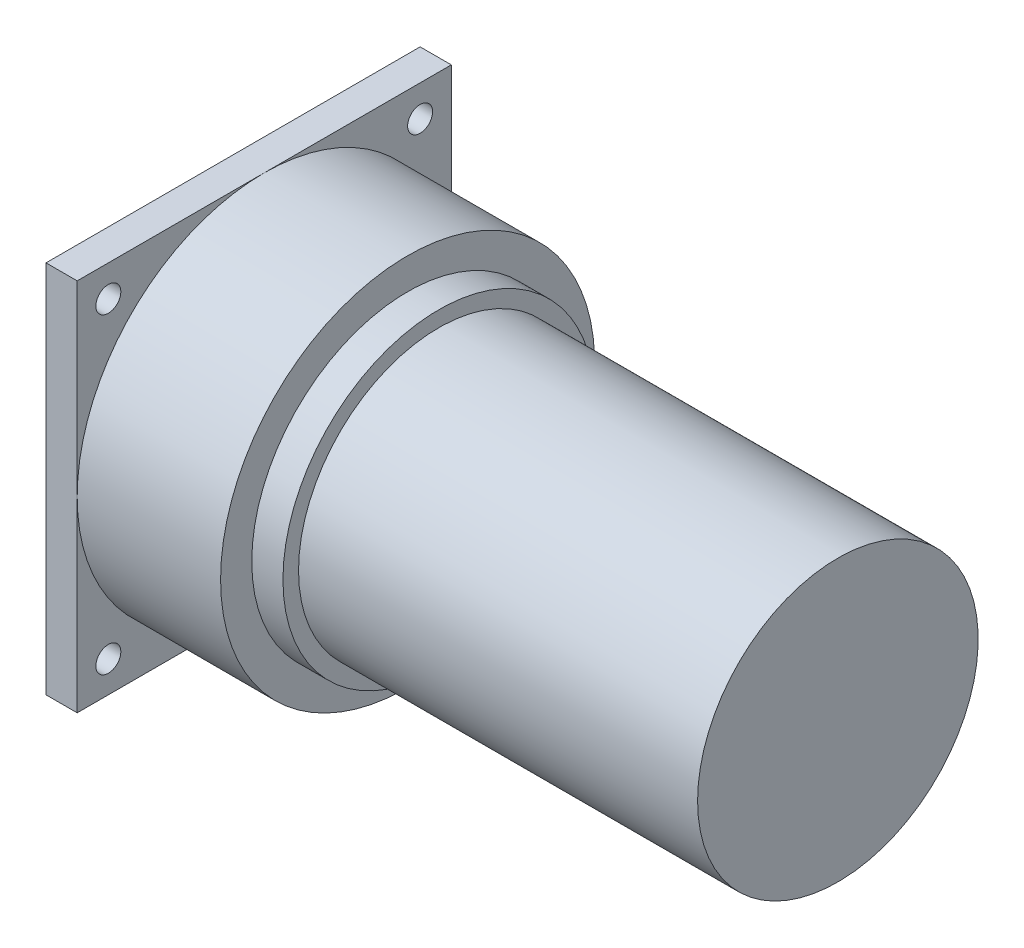
ISO-10303-21;
HEADER;
FILE_DESCRIPTION(('STEP AP214'),'2;1');
FILE_NAME('part.step','',(''),(''),'','','');
FILE_SCHEMA(('AUTOMOTIVE_DESIGN { 1 0 10303 214 1 1 1 1 }'));
ENDSEC;
DATA;
#1=APPLICATION_CONTEXT('core data for automotive mechanical design processes');
#2=APPLICATION_PROTOCOL_DEFINITION('international standard','automotive_design',2000,#1);
#3=PRODUCT_CONTEXT('',#1,'mechanical');
#4=PRODUCT('Part','Part','',(#3));
#5=PRODUCT_RELATED_PRODUCT_CATEGORY('part','',(#4));
#6=PRODUCT_DEFINITION_FORMATION('','',#4);
#7=PRODUCT_DEFINITION_CONTEXT('part definition',#1,'design');
#8=PRODUCT_DEFINITION('design','',#6,#7);
#9=PRODUCT_DEFINITION_SHAPE('','',#8);
#10=(LENGTH_UNIT() NAMED_UNIT(*) SI_UNIT(.MILLI.,.METRE.));
#11=(NAMED_UNIT(*) PLANE_ANGLE_UNIT() SI_UNIT($,.RADIAN.));
#12=(NAMED_UNIT(*) SI_UNIT($,.STERADIAN.) SOLID_ANGLE_UNIT());
#13=UNCERTAINTY_MEASURE_WITH_UNIT(LENGTH_MEASURE(1.E-05),#10,'distance_accuracy_value','');
#14=(GEOMETRIC_REPRESENTATION_CONTEXT(3) GLOBAL_UNCERTAINTY_ASSIGNED_CONTEXT((#13)) GLOBAL_UNIT_ASSIGNED_CONTEXT((#10,
#11,#12)) REPRESENTATION_CONTEXT('',''));
#15=CARTESIAN_POINT('',(0.,0.,0.));
#16=DIRECTION('',(0.,0.,1.));
#17=DIRECTION('',(1.,0.,0.));
#18=AXIS2_PLACEMENT_3D('',#15,#16,#17);
#19=CARTESIAN_POINT('',(0.,0.,0.));
#20=DIRECTION('',(-1.,0.,0.));
#21=DIRECTION('',(0.,0.,1.));
#22=AXIS2_PLACEMENT_3D('',#19,#20,#21);
#23=CYLINDRICAL_SURFACE('',#22,30.);
#24=CARTESIAN_POINT('',(22.,0.,0.));
#25=DIRECTION('',(-1.,0.,0.));
#26=DIRECTION('',(0.,0.,1.));
#27=AXIS2_PLACEMENT_3D('',#24,#25,#26);
#28=CIRCLE('',#27,30.);
#29=CARTESIAN_POINT('',(22.,0.,30.));
#30=VERTEX_POINT('',#29);
#31=CARTESIAN_POINT('',(22.,30.,0.));
#32=VERTEX_POINT('',#31);
#33=EDGE_CURVE('E140',#30,#32,#28,.T.);
#34=ORIENTED_EDGE('',*,*,#33,.F.);
#35=CARTESIAN_POINT('',(22.,-30.,0.));
#36=VERTEX_POINT('',#35);
#37=EDGE_CURVE('E139',#36,#30,#28,.T.);
#38=ORIENTED_EDGE('',*,*,#37,.F.);
#39=CARTESIAN_POINT('',(22.,0.,-30.));
#40=VERTEX_POINT('',#39);
#41=EDGE_CURVE('E55',#40,#36,#28,.T.);
#42=ORIENTED_EDGE('',*,*,#41,.F.);
#43=EDGE_CURVE('E59',#32,#40,#28,.T.);
#44=ORIENTED_EDGE('',*,*,#43,.F.);
#45=EDGE_LOOP('',(#34,#38,#42,#44));
#46=FACE_BOUND('',#45,.T.);
#47=CARTESIAN_POINT('',(45.,0.,0.));
#48=DIRECTION('',(-1.,0.,0.));
#49=DIRECTION('',(0.,0.,1.));
#50=AXIS2_PLACEMENT_3D('',#47,#48,#49);
#51=CIRCLE('',#50,30.);
#52=CARTESIAN_POINT('',(45.,0.,30.));
#53=VERTEX_POINT('',#52);
#54=EDGE_CURVE('E136',#53,#53,#51,.T.);
#55=ORIENTED_EDGE('',*,*,#54,.T.);
#56=EDGE_LOOP('',(#55));
#57=FACE_BOUND('',#56,.T.);
#58=ADVANCED_FACE('F40',(#46,#57),#23,.T.);
#59=CARTESIAN_POINT('',(45.,0.,-30.));
#60=DIRECTION('',(-1.,0.,0.));
#61=DIRECTION('',(0.,0.,1.));
#62=AXIS2_PLACEMENT_3D('',#59,#60,#61);
#63=PLANE('',#62);
#64=ORIENTED_EDGE('',*,*,#54,.F.);
#65=EDGE_LOOP('',(#64));
#66=FACE_BOUND('',#65,.T.);
#67=CARTESIAN_POINT('',(45.,0.,0.));
#68=DIRECTION('',(-1.,0.,0.));
#69=DIRECTION('',(0.,0.,1.));
#70=AXIS2_PLACEMENT_3D('',#67,#68,#69);
#71=CIRCLE('',#70,25.);
#72=CARTESIAN_POINT('',(45.,0.,25.));
#73=VERTEX_POINT('',#72);
#74=EDGE_CURVE('E133',#73,#73,#71,.T.);
#75=ORIENTED_EDGE('',*,*,#74,.T.);
#76=EDGE_LOOP('',(#75));
#77=FACE_BOUND('',#76,.T.);
#78=ADVANCED_FACE('F165',(#66,#77),#63,.F.);
#79=CARTESIAN_POINT('',(0.,0.,0.));
#80=DIRECTION('',(-1.,0.,0.));
#81=DIRECTION('',(0.,0.,1.));
#82=AXIS2_PLACEMENT_3D('',#79,#80,#81);
#83=CYLINDRICAL_SURFACE('',#82,25.);
#84=ORIENTED_EDGE('',*,*,#74,.F.);
#85=EDGE_LOOP('',(#84));
#86=FACE_BOUND('',#85,.T.);
#87=CARTESIAN_POINT('',(50.,0.,0.));
#88=DIRECTION('',(-1.,0.,0.));
#89=DIRECTION('',(0.,0.,1.));
#90=AXIS2_PLACEMENT_3D('',#87,#88,#89);
#91=CIRCLE('',#90,25.);
#92=CARTESIAN_POINT('',(50.,0.,25.));
#93=VERTEX_POINT('',#92);
#94=EDGE_CURVE('E130',#93,#93,#91,.T.);
#95=ORIENTED_EDGE('',*,*,#94,.T.);
#96=EDGE_LOOP('',(#95));
#97=FACE_BOUND('',#96,.T.);
#98=ADVANCED_FACE('F170',(#86,#97),#83,.T.);
#99=CARTESIAN_POINT('',(50.,0.,-25.));
#100=DIRECTION('',(-1.,0.,0.));
#101=DIRECTION('',(0.,0.,1.));
#102=AXIS2_PLACEMENT_3D('',#99,#100,#101);
#103=PLANE('',#102);
#104=ORIENTED_EDGE('',*,*,#94,.F.);
#105=EDGE_LOOP('',(#104));
#106=FACE_BOUND('',#105,.T.);
#107=CARTESIAN_POINT('',(50.,0.,0.));
#108=DIRECTION('',(-1.,0.,0.));
#109=DIRECTION('',(0.,0.,1.));
#110=AXIS2_PLACEMENT_3D('',#107,#108,#109);
#111=CIRCLE('',#110,22.5);
#112=CARTESIAN_POINT('',(50.,0.,22.5));
#113=VERTEX_POINT('',#112);
#114=EDGE_CURVE('E122',#113,#113,#111,.T.);
#115=ORIENTED_EDGE('',*,*,#114,.T.);
#116=EDGE_LOOP('',(#115));
#117=FACE_BOUND('',#116,.T.);
#118=ADVANCED_FACE('F177',(#106,#117),#103,.F.);
#119=CARTESIAN_POINT('',(0.,0.,0.));
#120=DIRECTION('',(-1.,0.,0.));
#121=DIRECTION('',(0.,0.,1.));
#122=AXIS2_PLACEMENT_3D('',#119,#120,#121);
#123=CYLINDRICAL_SURFACE('',#122,22.5);
#124=ORIENTED_EDGE('',*,*,#114,.F.);
#125=EDGE_LOOP('',(#124));
#126=FACE_BOUND('',#125,.T.);
#127=CARTESIAN_POINT('',(114.,0.,0.));
#128=DIRECTION('',(-1.,0.,0.));
#129=DIRECTION('',(0.,0.,1.));
#130=AXIS2_PLACEMENT_3D('',#127,#128,#129);
#131=CIRCLE('',#130,22.5);
#132=CARTESIAN_POINT('',(114.,0.,22.5));
#133=VERTEX_POINT('',#132);
#134=EDGE_CURVE('E119',#133,#133,#131,.T.);
#135=ORIENTED_EDGE('',*,*,#134,.T.);
#136=EDGE_LOOP('',(#135));
#137=FACE_BOUND('',#136,.T.);
#138=ADVANCED_FACE('F181',(#126,#137),#123,.T.);
#139=CARTESIAN_POINT('',(114.,0.,-22.5));
#140=DIRECTION('',(-1.,0.,0.));
#141=DIRECTION('',(0.,0.,1.));
#142=AXIS2_PLACEMENT_3D('',#139,#140,#141);
#143=PLANE('',#142);
#144=ORIENTED_EDGE('',*,*,#134,.F.);
#145=EDGE_LOOP('',(#144));
#146=FACE_BOUND('',#145,.T.);
#147=ADVANCED_FACE('F185',(#146),#143,.F.);
#148=CARTESIAN_POINT('',(22.,0.,0.));
#149=DIRECTION('',(1.,0.,0.));
#150=DIRECTION('',(0.,0.,-1.));
#151=AXIS2_PLACEMENT_3D('',#148,#149,#150);
#152=PLANE('',#151);
#153=ORIENTED_EDGE('',*,*,#43,.T.);
#154=DIRECTION('',(0.,-1.,0.));
#155=VECTOR('',#154,1.);
#156=CARTESIAN_POINT('',(22.,-30.,-30.));
#157=LINE('',#156,#155);
#158=CARTESIAN_POINT('',(22.,30.,-30.));
#159=VERTEX_POINT('',#158);
#160=EDGE_CURVE('E225',#159,#40,#157,.T.);
#161=ORIENTED_EDGE('',*,*,#160,.F.);
#162=DIRECTION('',(0.,0.,-1.));
#163=VECTOR('',#162,1.);
#164=CARTESIAN_POINT('',(22.,30.,-30.));
#165=LINE('',#164,#163);
#166=EDGE_CURVE('E211',#32,#159,#165,.T.);
#167=ORIENTED_EDGE('',*,*,#166,.F.);
#168=EDGE_LOOP('',(#153,#161,#167));
#169=FACE_BOUND('',#168,.T.);
#170=CARTESIAN_POINT('',(22.,25.,-25.));
#171=DIRECTION('',(-1.,0.,0.));
#172=DIRECTION('',(0.,0.,1.));
#173=AXIS2_PLACEMENT_3D('',#170,#171,#172);
#174=CIRCLE('',#173,2.00000000000001);
#175=CARTESIAN_POINT('',(22.,25.,-23.));
#176=VERTEX_POINT('',#175);
#177=EDGE_CURVE('E240',#176,#176,#174,.T.);
#178=ORIENTED_EDGE('',*,*,#177,.T.);
#179=EDGE_LOOP('',(#178));
#180=FACE_BOUND('',#179,.T.);
#181=ADVANCED_FACE('F160',(#169,#180),#152,.T.);
#182=ORIENTED_EDGE('',*,*,#33,.T.);
#183=CARTESIAN_POINT('',(22.,30.,30.));
#184=VERTEX_POINT('',#183);
#185=EDGE_CURVE('E112',#184,#32,#165,.T.);
#186=ORIENTED_EDGE('',*,*,#185,.F.);
#187=DIRECTION('',(0.,1.,0.));
#188=VECTOR('',#187,1.);
#189=CARTESIAN_POINT('',(22.,-30.,30.));
#190=LINE('',#189,#188);
#191=EDGE_CURVE('E228',#30,#184,#190,.T.);
#192=ORIENTED_EDGE('',*,*,#191,.F.);
#193=EDGE_LOOP('',(#182,#186,#192));
#194=FACE_BOUND('',#193,.T.);
#195=CARTESIAN_POINT('',(22.,25.,25.));
#196=DIRECTION('',(-1.,0.,0.));
#197=DIRECTION('',(0.,0.,1.));
#198=AXIS2_PLACEMENT_3D('',#195,#196,#197);
#199=CIRCLE('',#198,2.00000000000001);
#200=CARTESIAN_POINT('',(22.,25.,27.));
#201=VERTEX_POINT('',#200);
#202=EDGE_CURVE('E247',#201,#201,#199,.T.);
#203=ORIENTED_EDGE('',*,*,#202,.T.);
#204=EDGE_LOOP('',(#203));
#205=FACE_BOUND('',#204,.T.);
#206=ADVANCED_FACE('F161',(#194,#205),#152,.T.);
#207=ORIENTED_EDGE('',*,*,#37,.T.);
#208=CARTESIAN_POINT('',(22.,-30.,30.));
#209=VERTEX_POINT('',#208);
#210=EDGE_CURVE('E216',#209,#30,#190,.T.);
#211=ORIENTED_EDGE('',*,*,#210,.F.);
#212=DIRECTION('',(0.,0.,1.));
#213=VECTOR('',#212,1.);
#214=CARTESIAN_POINT('',(22.,-30.,-30.));
#215=LINE('',#214,#213);
#216=EDGE_CURVE('E226',#36,#209,#215,.T.);
#217=ORIENTED_EDGE('',*,*,#216,.F.);
#218=EDGE_LOOP('',(#207,#211,#217));
#219=FACE_BOUND('',#218,.T.);
#220=CARTESIAN_POINT('',(22.,-25.,25.));
#221=DIRECTION('',(-1.,0.,0.));
#222=DIRECTION('',(0.,0.,1.));
#223=AXIS2_PLACEMENT_3D('',#220,#221,#222);
#224=CIRCLE('',#223,2.00000000000001);
#225=CARTESIAN_POINT('',(22.,-25.,27.));
#226=VERTEX_POINT('',#225);
#227=EDGE_CURVE('E253',#226,#226,#224,.T.);
#228=ORIENTED_EDGE('',*,*,#227,.T.);
#229=EDGE_LOOP('',(#228));
#230=FACE_BOUND('',#229,.T.);
#231=ADVANCED_FACE('F152',(#219,#230),#152,.T.);
#232=CARTESIAN_POINT('',(17.,0.,0.));
#233=DIRECTION('',(1.,0.,0.));
#234=DIRECTION('',(0.,0.,-1.));
#235=AXIS2_PLACEMENT_3D('',#232,#233,#234);
#236=PLANE('',#235);
#237=CARTESIAN_POINT('',(17.,0.,0.));
#238=DIRECTION('',(1.,0.,0.));
#239=DIRECTION('',(0.,0.,-1.));
#240=AXIS2_PLACEMENT_3D('',#237,#238,#239);
#241=CIRCLE('',#240,4.);
#242=CARTESIAN_POINT('',(17.,0.,-4.));
#243=VERTEX_POINT('',#242);
#244=EDGE_CURVE('E11',#243,#243,#241,.T.);
#245=ORIENTED_EDGE('',*,*,#244,.T.);
#246=EDGE_LOOP('',(#245));
#247=FACE_BOUND('',#246,.T.);
#248=DIRECTION('',(0.,-1.,0.));
#249=VECTOR('',#248,1.);
#250=CARTESIAN_POINT('',(17.,-30.,-30.));
#251=LINE('',#250,#249);
#252=CARTESIAN_POINT('',(17.,30.,-30.));
#253=VERTEX_POINT('',#252);
#254=CARTESIAN_POINT('',(17.,-30.,-30.));
#255=VERTEX_POINT('',#254);
#256=EDGE_CURVE('E102',#253,#255,#251,.T.);
#257=ORIENTED_EDGE('',*,*,#256,.T.);
#258=DIRECTION('',(0.,0.,1.));
#259=VECTOR('',#258,1.);
#260=CARTESIAN_POINT('',(17.,-30.,-30.));
#261=LINE('',#260,#259);
#262=CARTESIAN_POINT('',(17.,-30.,30.));
#263=VERTEX_POINT('',#262);
#264=EDGE_CURVE('E91',#255,#263,#261,.T.);
#265=ORIENTED_EDGE('',*,*,#264,.T.);
#266=DIRECTION('',(0.,1.,0.));
#267=VECTOR('',#266,1.);
#268=CARTESIAN_POINT('',(17.,-30.,30.));
#269=LINE('',#268,#267);
#270=CARTESIAN_POINT('',(17.,30.,30.));
#271=VERTEX_POINT('',#270);
#272=EDGE_CURVE('E101',#263,#271,#269,.T.);
#273=ORIENTED_EDGE('',*,*,#272,.T.);
#274=DIRECTION('',(0.,0.,-1.));
#275=VECTOR('',#274,1.);
#276=CARTESIAN_POINT('',(17.,30.,-30.));
#277=LINE('',#276,#275);
#278=EDGE_CURVE('E108',#271,#253,#277,.T.);
#279=ORIENTED_EDGE('',*,*,#278,.T.);
#280=EDGE_LOOP('',(#257,#265,#273,#279));
#281=FACE_BOUND('',#280,.T.);
#282=CARTESIAN_POINT('',(17.,25.,-25.));
#283=DIRECTION('',(-1.,0.,0.));
#284=DIRECTION('',(0.,0.,1.));
#285=AXIS2_PLACEMENT_3D('',#282,#283,#284);
#286=CIRCLE('',#285,2.00000000000001);
#287=CARTESIAN_POINT('',(17.,25.,-23.));
#288=VERTEX_POINT('',#287);
#289=EDGE_CURVE('E238',#288,#288,#286,.T.);
#290=ORIENTED_EDGE('',*,*,#289,.F.);
#291=EDGE_LOOP('',(#290));
#292=FACE_BOUND('',#291,.T.);
#293=CARTESIAN_POINT('',(17.,25.,25.));
#294=DIRECTION('',(-1.,0.,0.));
#295=DIRECTION('',(0.,0.,1.));
#296=AXIS2_PLACEMENT_3D('',#293,#294,#295);
#297=CIRCLE('',#296,2.00000000000001);
#298=CARTESIAN_POINT('',(17.,25.,27.));
#299=VERTEX_POINT('',#298);
#300=EDGE_CURVE('E244',#299,#299,#297,.T.);
#301=ORIENTED_EDGE('',*,*,#300,.F.);
#302=EDGE_LOOP('',(#301));
#303=FACE_BOUND('',#302,.T.);
#304=CARTESIAN_POINT('',(17.,-25.,25.));
#305=DIRECTION('',(-1.,0.,0.));
#306=DIRECTION('',(0.,0.,1.));
#307=AXIS2_PLACEMENT_3D('',#304,#305,#306);
#308=CIRCLE('',#307,2.00000000000001);
#309=CARTESIAN_POINT('',(17.,-25.,27.));
#310=VERTEX_POINT('',#309);
#311=EDGE_CURVE('E250',#310,#310,#308,.T.);
#312=ORIENTED_EDGE('',*,*,#311,.F.);
#313=EDGE_LOOP('',(#312));
#314=FACE_BOUND('',#313,.T.);
#315=CARTESIAN_POINT('',(17.,-25.,-25.));
#316=DIRECTION('',(-1.,0.,0.));
#317=DIRECTION('',(0.,0.,1.));
#318=AXIS2_PLACEMENT_3D('',#315,#316,#317);
#319=CIRCLE('',#318,2.00000000000001);
#320=CARTESIAN_POINT('',(17.,-25.,-23.));
#321=VERTEX_POINT('',#320);
#322=EDGE_CURVE('E256',#321,#321,#319,.T.);
#323=ORIENTED_EDGE('',*,*,#322,.F.);
#324=EDGE_LOOP('',(#323));
#325=FACE_BOUND('',#324,.T.);
#326=ADVANCED_FACE('F105',(#247,#281,#292,#303,#314,#325),#236,.F.);
#327=ORIENTED_EDGE('',*,*,#41,.T.);
#328=CARTESIAN_POINT('',(22.,-30.,-30.));
#329=VERTEX_POINT('',#328);
#330=EDGE_CURVE('E227',#329,#36,#215,.T.);
#331=ORIENTED_EDGE('',*,*,#330,.F.);
#332=EDGE_CURVE('E117',#40,#329,#157,.T.);
#333=ORIENTED_EDGE('',*,*,#332,.F.);
#334=EDGE_LOOP('',(#327,#331,#333));
#335=FACE_BOUND('',#334,.T.);
#336=CARTESIAN_POINT('',(22.,-25.,-25.));
#337=DIRECTION('',(-1.,0.,0.));
#338=DIRECTION('',(0.,0.,1.));
#339=AXIS2_PLACEMENT_3D('',#336,#337,#338);
#340=CIRCLE('',#339,2.00000000000001);
#341=CARTESIAN_POINT('',(22.,-25.,-23.));
#342=VERTEX_POINT('',#341);
#343=EDGE_CURVE('E259',#342,#342,#340,.T.);
#344=ORIENTED_EDGE('',*,*,#343,.T.);
#345=EDGE_LOOP('',(#344));
#346=FACE_BOUND('',#345,.T.);
#347=ADVANCED_FACE('F151',(#335,#346),#152,.T.);
#348=CARTESIAN_POINT('',(17.,-30.,-30.));
#349=DIRECTION('',(0.,0.,1.));
#350=DIRECTION('',(0.,-1.,0.));
#351=AXIS2_PLACEMENT_3D('',#348,#349,#350);
#352=PLANE('',#351);
#353=ORIENTED_EDGE('',*,*,#160,.T.);
#354=ORIENTED_EDGE('',*,*,#332,.T.);
#355=DIRECTION('',(1.,0.,0.));
#356=VECTOR('',#355,1.);
#357=CARTESIAN_POINT('',(17.,-30.,-30.));
#358=LINE('',#357,#356);
#359=EDGE_CURVE('E96',#255,#329,#358,.T.);
#360=ORIENTED_EDGE('',*,*,#359,.F.);
#361=ORIENTED_EDGE('',*,*,#256,.F.);
#362=DIRECTION('',(1.,0.,0.));
#363=VECTOR('',#362,1.);
#364=CARTESIAN_POINT('',(17.,30.,-30.));
#365=LINE('',#364,#363);
#366=EDGE_CURVE('E220',#253,#159,#365,.T.);
#367=ORIENTED_EDGE('',*,*,#366,.T.);
#368=EDGE_LOOP('',(#353,#354,#360,#361,#367));
#369=FACE_BOUND('',#368,.T.);
#370=ADVANCED_FACE('F115',(#369),#352,.F.);
#371=CARTESIAN_POINT('',(17.,-30.,-30.));
#372=DIRECTION('',(0.,1.,0.));
#373=DIRECTION('',(0.,0.,1.));
#374=AXIS2_PLACEMENT_3D('',#371,#372,#373);
#375=PLANE('',#374);
#376=ORIENTED_EDGE('',*,*,#330,.T.);
#377=ORIENTED_EDGE('',*,*,#216,.T.);
#378=DIRECTION('',(1.,0.,0.));
#379=VECTOR('',#378,1.);
#380=CARTESIAN_POINT('',(17.,-30.,30.));
#381=LINE('',#380,#379);
#382=EDGE_CURVE('E98',#263,#209,#381,.T.);
#383=ORIENTED_EDGE('',*,*,#382,.F.);
#384=ORIENTED_EDGE('',*,*,#264,.F.);
#385=ORIENTED_EDGE('',*,*,#359,.T.);
#386=EDGE_LOOP('',(#376,#377,#383,#384,#385));
#387=FACE_BOUND('',#386,.T.);
#388=ADVANCED_FACE('F94',(#387),#375,.F.);
#389=CARTESIAN_POINT('',(17.,-30.,30.));
#390=DIRECTION('',(0.,0.,-1.));
#391=DIRECTION('',(-1.,0.,0.));
#392=AXIS2_PLACEMENT_3D('',#389,#390,#391);
#393=PLANE('',#392);
#394=ORIENTED_EDGE('',*,*,#210,.T.);
#395=ORIENTED_EDGE('',*,*,#191,.T.);
#396=DIRECTION('',(1.,0.,0.));
#397=VECTOR('',#396,1.);
#398=CARTESIAN_POINT('',(17.,30.,30.));
#399=LINE('',#398,#397);
#400=EDGE_CURVE('E124',#271,#184,#399,.T.);
#401=ORIENTED_EDGE('',*,*,#400,.F.);
#402=ORIENTED_EDGE('',*,*,#272,.F.);
#403=ORIENTED_EDGE('',*,*,#382,.T.);
#404=EDGE_LOOP('',(#394,#395,#401,#402,#403));
#405=FACE_BOUND('',#404,.T.);
#406=ADVANCED_FACE('F194',(#405),#393,.F.);
#407=CARTESIAN_POINT('',(17.,30.,-30.));
#408=DIRECTION('',(0.,-1.,0.));
#409=DIRECTION('',(0.,0.,-1.));
#410=AXIS2_PLACEMENT_3D('',#407,#408,#409);
#411=PLANE('',#410);
#412=ORIENTED_EDGE('',*,*,#185,.T.);
#413=ORIENTED_EDGE('',*,*,#166,.T.);
#414=ORIENTED_EDGE('',*,*,#366,.F.);
#415=ORIENTED_EDGE('',*,*,#278,.F.);
#416=ORIENTED_EDGE('',*,*,#400,.T.);
#417=EDGE_LOOP('',(#412,#413,#414,#415,#416));
#418=FACE_BOUND('',#417,.T.);
#419=ADVANCED_FACE('F197',(#418),#411,.F.);
#420=CARTESIAN_POINT('',(17.,25.,-25.));
#421=DIRECTION('',(1.,0.,0.));
#422=DIRECTION('',(0.,0.,-1.));
#423=AXIS2_PLACEMENT_3D('',#420,#421,#422);
#424=CYLINDRICAL_SURFACE('',#423,2.00000000000001);
#425=ORIENTED_EDGE('',*,*,#289,.T.);
#426=EDGE_LOOP('',(#425));
#427=FACE_BOUND('',#426,.T.);
#428=ORIENTED_EDGE('',*,*,#177,.F.);
#429=EDGE_LOOP('',(#428));
#430=FACE_BOUND('',#429,.T.);
#431=ADVANCED_FACE('F200',(#427,#430),#424,.F.);
#432=CARTESIAN_POINT('',(17.,25.,25.));
#433=DIRECTION('',(1.,0.,0.));
#434=DIRECTION('',(0.,0.,-1.));
#435=AXIS2_PLACEMENT_3D('',#432,#433,#434);
#436=CYLINDRICAL_SURFACE('',#435,2.00000000000001);
#437=ORIENTED_EDGE('',*,*,#300,.T.);
#438=EDGE_LOOP('',(#437));
#439=FACE_BOUND('',#438,.T.);
#440=ORIENTED_EDGE('',*,*,#202,.F.);
#441=EDGE_LOOP('',(#440));
#442=FACE_BOUND('',#441,.T.);
#443=ADVANCED_FACE('F205',(#439,#442),#436,.F.);
#444=CARTESIAN_POINT('',(17.,-25.,25.));
#445=DIRECTION('',(1.,0.,0.));
#446=DIRECTION('',(0.,0.,-1.));
#447=AXIS2_PLACEMENT_3D('',#444,#445,#446);
#448=CYLINDRICAL_SURFACE('',#447,2.00000000000001);
#449=ORIENTED_EDGE('',*,*,#311,.T.);
#450=EDGE_LOOP('',(#449));
#451=FACE_BOUND('',#450,.T.);
#452=ORIENTED_EDGE('',*,*,#227,.F.);
#453=EDGE_LOOP('',(#452));
#454=FACE_BOUND('',#453,.T.);
#455=ADVANCED_FACE('F269',(#451,#454),#448,.F.);
#456=CARTESIAN_POINT('',(17.,-25.,-25.));
#457=DIRECTION('',(1.,0.,0.));
#458=DIRECTION('',(0.,0.,-1.));
#459=AXIS2_PLACEMENT_3D('',#456,#457,#458);
#460=CYLINDRICAL_SURFACE('',#459,2.00000000000001);
#461=ORIENTED_EDGE('',*,*,#322,.T.);
#462=EDGE_LOOP('',(#461));
#463=FACE_BOUND('',#462,.T.);
#464=ORIENTED_EDGE('',*,*,#343,.F.);
#465=EDGE_LOOP('',(#464));
#466=FACE_BOUND('',#465,.T.);
#467=ADVANCED_FACE('F265',(#463,#466),#460,.F.);
#468=CARTESIAN_POINT('',(0.,0.,0.));
#469=DIRECTION('',(1.,0.,0.));
#470=DIRECTION('',(0.,0.,-1.));
#471=AXIS2_PLACEMENT_3D('',#468,#469,#470);
#472=PLANE('',#471);
#473=CARTESIAN_POINT('',(0.,0.,0.));
#474=DIRECTION('',(-1.,0.,0.));
#475=DIRECTION('',(0.,0.,1.));
#476=AXIS2_PLACEMENT_3D('',#473,#474,#475);
#477=CIRCLE('',#476,4.);
#478=CARTESIAN_POINT('',(0.,0.,4.));
#479=VERTEX_POINT('',#478);
#480=EDGE_CURVE('E48',#479,#479,#477,.T.);
#481=ORIENTED_EDGE('',*,*,#480,.T.);
#482=EDGE_LOOP('',(#481));
#483=FACE_BOUND('',#482,.T.);
#484=ADVANCED_FACE('F42',(#483),#472,.F.);
#485=CARTESIAN_POINT('',(0.,0.,0.));
#486=DIRECTION('',(-1.,0.,0.));
#487=DIRECTION('',(0.,0.,1.));
#488=AXIS2_PLACEMENT_3D('',#485,#486,#487);
#489=CYLINDRICAL_SURFACE('',#488,4.);
#490=ORIENTED_EDGE('',*,*,#480,.F.);
#491=EDGE_LOOP('',(#490));
#492=FACE_BOUND('',#491,.T.);
#493=ORIENTED_EDGE('',*,*,#244,.F.);
#494=EDGE_LOOP('',(#493));
#495=FACE_BOUND('',#494,.T.);
#496=ADVANCED_FACE('F145',(#492,#495),#489,.T.);
#497=CLOSED_SHELL('',(#58,#78,#98,#118,#138,#147,#181,#206,#231,#326,#347,#370,#388,#406,#419,
#431,#443,#455,#467,#484,#496));
#498=MANIFOLD_SOLID_BREP('B2',#497);
#499=ADVANCED_BREP_SHAPE_REPRESENTATION('',(#18,#498),#14);
#500=SHAPE_DEFINITION_REPRESENTATION(#9,#499);
ENDSEC;
END-ISO-10303-21;
